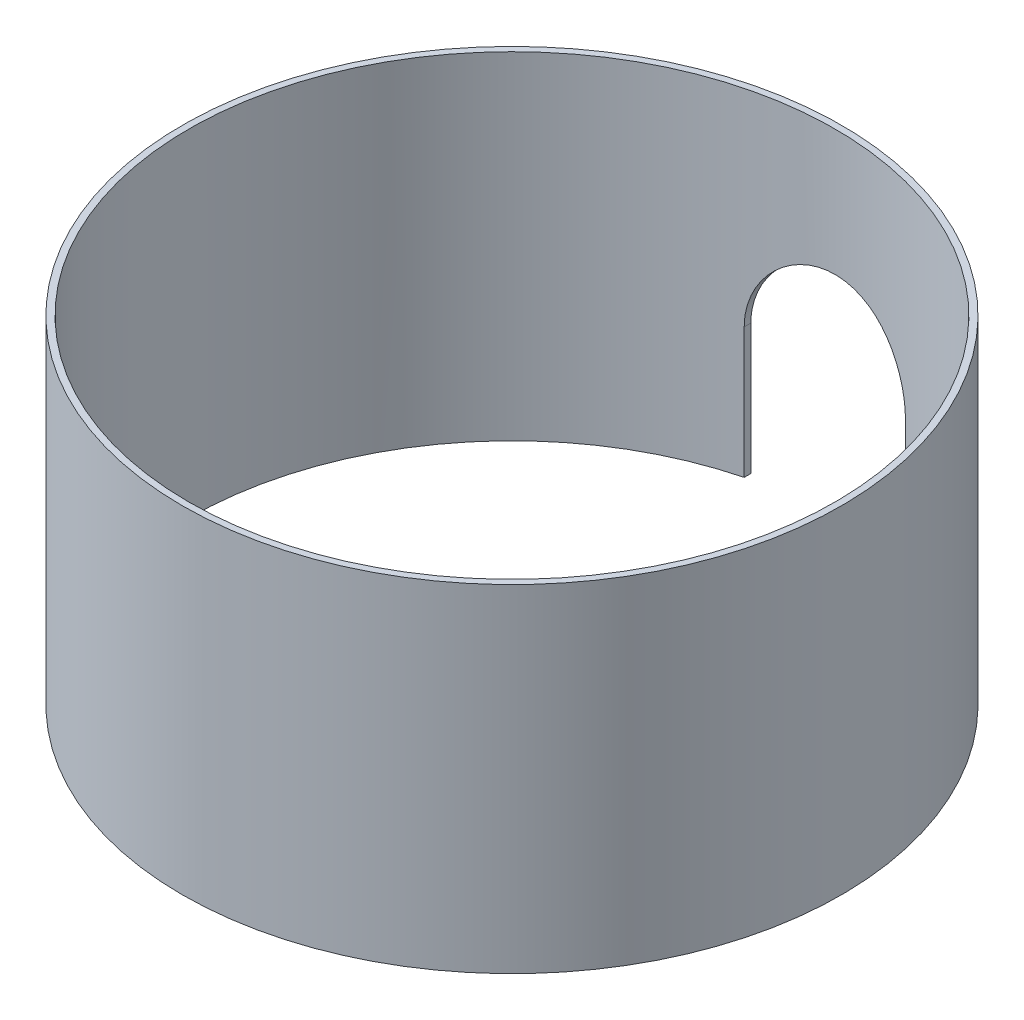
ISO-10303-21;
HEADER;
FILE_DESCRIPTION(('STEP AP214'),'2;1');
FILE_NAME('part.step','',(''),(''),'','','');
FILE_SCHEMA(('AUTOMOTIVE_DESIGN { 1 0 10303 214 1 1 1 1 }'));
ENDSEC;
DATA;
#1=APPLICATION_CONTEXT('core data for automotive mechanical design processes');
#2=APPLICATION_PROTOCOL_DEFINITION('international standard','automotive_design',2000,#1);
#3=PRODUCT_CONTEXT('',#1,'mechanical');
#4=PRODUCT('Part','Part','',(#3));
#5=PRODUCT_RELATED_PRODUCT_CATEGORY('part','',(#4));
#6=PRODUCT_DEFINITION_FORMATION('','',#4);
#7=PRODUCT_DEFINITION_CONTEXT('part definition',#1,'design');
#8=PRODUCT_DEFINITION('design','',#6,#7);
#9=PRODUCT_DEFINITION_SHAPE('','',#8);
#10=(LENGTH_UNIT() NAMED_UNIT(*) SI_UNIT(.MILLI.,.METRE.));
#11=(NAMED_UNIT(*) PLANE_ANGLE_UNIT() SI_UNIT($,.RADIAN.));
#12=(NAMED_UNIT(*) SI_UNIT($,.STERADIAN.) SOLID_ANGLE_UNIT());
#13=UNCERTAINTY_MEASURE_WITH_UNIT(LENGTH_MEASURE(1.E-05),#10,'distance_accuracy_value','');
#14=(GEOMETRIC_REPRESENTATION_CONTEXT(3) GLOBAL_UNCERTAINTY_ASSIGNED_CONTEXT((#13)) GLOBAL_UNIT_ASSIGNED_CONTEXT((#10,
#11,#12)) REPRESENTATION_CONTEXT('',''));
#15=CARTESIAN_POINT('',(0.,0.,0.));
#16=DIRECTION('',(0.,0.,1.));
#17=DIRECTION('',(1.,0.,0.));
#18=AXIS2_PLACEMENT_3D('',#15,#16,#17);
#19=CARTESIAN_POINT('',(-43.8588027188166,54.,17.1756459154877));
#20=DIRECTION('',(0.,-1.,0.));
#21=DIRECTION('',(0.,0.,-1.));
#22=AXIS2_PLACEMENT_3D('',#19,#20,#21);
#23=CYLINDRICAL_SURFACE('',#22,51.837999999999);
#24=CARTESIAN_POINT('',(-43.8588027188166,0.,17.1756459154877));
#25=DIRECTION('',(0.,1.,0.));
#26=DIRECTION('',(0.,0.,1.));
#27=AXIS2_PLACEMENT_3D('',#24,#25,#26);
#28=CIRCLE('',#27,51.837999999999);
#29=CARTESIAN_POINT('',(-56.5408027188166,0.,-33.0871148523004));
#30=VERTEX_POINT('',#29);
#31=CARTESIAN_POINT('',(-31.1768027188166,0.,-33.0871148523004));
#32=VERTEX_POINT('',#31);
#33=EDGE_CURVE('E94',#30,#32,#28,.T.);
#34=ORIENTED_EDGE('',*,*,#33,.T.);
#35=DIRECTION('',(0.,-1.,0.));
#36=VECTOR('',#35,1.);
#37=CARTESIAN_POINT('',(-31.1768027188166,54.,-33.0871148523004));
#38=LINE('',#37,#36);
#39=CARTESIAN_POINT('',(-31.1768027188166,20.5,-33.0871148523004));
#40=VERTEX_POINT('',#39);
#41=EDGE_CURVE('E55',#32,#40,#38,.F.);
#42=ORIENTED_EDGE('',*,*,#41,.T.);
#43=CARTESIAN_POINT('',(-31.1768027188166,20.5,-33.0871148523004));
#44=CARTESIAN_POINT('',(-31.1767585044862,20.8509707048646,-33.0870753782632));
#45=CARTESIAN_POINT('',(-31.1913702711197,21.2019276565611,-33.0907896110445));
#46=CARTESIAN_POINT('',(-31.2495807896242,21.9012222699142,-33.1054382651482));
#47=CARTESIAN_POINT('',(-31.2931748180934,22.2495603490293,-33.1163715099456));
#48=CARTESIAN_POINT('',(-31.4089137429404,22.9404768257428,-33.1451434593775));
#49=CARTESIAN_POINT('',(-31.4810036017332,23.2830650069326,-33.1629688508999));
#50=CARTESIAN_POINT('',(-31.653125949201,23.9607486776484,-33.2049812205444));
#51=CARTESIAN_POINT('',(-31.7531587897458,24.2958440727647,-33.2291682787751));
#52=CARTESIAN_POINT('',(-31.9803581518208,24.956185678297,-33.2831927837449));
#53=CARTESIAN_POINT('',(-32.1075214102456,25.2814330678124,-33.3130295509179));
#54=CARTESIAN_POINT('',(-32.3880209481271,25.919953227353,-33.3774955176801));
#55=CARTESIAN_POINT('',(-32.5413581804994,26.233225560894,-33.412124891745));
#56=CARTESIAN_POINT('',(-32.8731185152568,26.8458035527891,-33.4852051163808));
#57=CARTESIAN_POINT('',(-33.0515466880763,27.1451063718286,-33.5236567388987));
#58=CARTESIAN_POINT('',(-33.432223198295,27.7277708993825,-33.6033111894605));
#59=CARTESIAN_POINT('',(-33.6344718100622,28.0111324242268,-33.6445140491912));
#60=CARTESIAN_POINT('',(-34.0654214421825,28.5652515208272,-33.729334526315));
#61=CARTESIAN_POINT('',(-34.2945453608089,28.8356755827307,-33.7729828433602));
#62=CARTESIAN_POINT('',(-34.7746725702008,29.3564778434316,-33.8607762860972));
#63=CARTESIAN_POINT('',(-35.0256853016841,29.6068473024012,-33.9049216189334));
#64=CARTESIAN_POINT('',(-35.5479006976855,30.0858008114417,-33.9924812779061));
#65=CARTESIAN_POINT('',(-35.8191068206723,30.3143811143849,-34.0358954772549));
#66=CARTESIAN_POINT('',(-36.3797736854292,30.7480632163629,-34.1207741022373));
#67=CARTESIAN_POINT('',(-36.6692262003645,30.9531754807606,-34.1622393920708));
#68=CARTESIAN_POINT('',(-37.2686469365962,31.3412251155452,-34.2426460598185));
#69=CARTESIAN_POINT('',(-37.5788403896085,31.523823506795,-34.2815455137599));
#70=CARTESIAN_POINT('',(-38.2140279062847,31.8621797117428,-34.3550921426573));
#71=CARTESIAN_POINT('',(-38.5390221432348,32.0179372110883,-34.38973926781));
#72=CARTESIAN_POINT('',(-39.2014788646144,32.301365591604,-34.4537864231829));
#73=CARTESIAN_POINT('',(-39.5389393568719,32.4290409379638,-34.4831872874419));
#74=CARTESIAN_POINT('',(-40.2239421029105,32.6552872120294,-34.535900306431));
#75=CARTESIAN_POINT('',(-40.5714841319982,32.7538587878417,-34.5592125967451));
#76=CARTESIAN_POINT('',(-41.2672526248025,32.9194354410698,-34.5986832113195));
#77=CARTESIAN_POINT('',(-41.6153347041737,32.9870164077352,-34.6149716833242));
#78=CARTESIAN_POINT('',(-42.3161872841409,33.0928174855531,-34.6405825341867));
#79=CARTESIAN_POINT('',(-42.6689577300108,33.1310379391175,-34.6499049942844));
#80=CARTESIAN_POINT('',(-43.3765415447689,33.1777857589812,-34.6613182753683));
#81=CARTESIAN_POINT('',(-43.7313547031328,33.1863161321834,-34.6634098286741));
#82=CARTESIAN_POINT('',(-44.440413725083,33.1736174635119,-34.6603035825866));
#83=CARTESIAN_POINT('',(-44.7946595953477,33.1523887745874,-34.6551058696455));
#84=CARTESIAN_POINT('',(-45.4924328929101,33.0811264179135,-34.6377568279952));
#85=CARTESIAN_POINT('',(-45.8360279190726,33.0317158334055,-34.6257559467381));
#86=CARTESIAN_POINT('',(-46.5177281339013,32.9049760777509,-34.5952413901497));
#87=CARTESIAN_POINT('',(-46.8558334136606,32.8276473703539,-34.5767278230012));
#88=CARTESIAN_POINT('',(-47.5242274012856,32.6456888212515,-34.5336866164767));
#89=CARTESIAN_POINT('',(-47.8545159240128,32.5410583336122,-34.509158834811));
#90=CARTESIAN_POINT('',(-48.5050429606792,32.3053069369903,-34.4547448120285));
#91=CARTESIAN_POINT('',(-48.825281337324,32.1741856663005,-34.4248584977466));
#92=CARTESIAN_POINT('',(-49.456348182065,31.8851703598469,-34.360236940739));
#93=CARTESIAN_POINT('',(-49.7670699239587,31.7270523113126,-34.3254615951647));
#94=CARTESIAN_POINT('',(-50.3741168879895,31.3860008889086,-34.2521910056178));
#95=CARTESIAN_POINT('',(-50.6704420596137,31.203067427978,-34.2136957485946));
#96=CARTESIAN_POINT('',(-51.2467772033046,30.8136750221383,-34.134009218759));
#97=CARTESIAN_POINT('',(-51.5267888467712,30.60721849371,-34.0928182230594));
#98=CARTESIAN_POINT('',(-52.0688893748692,30.1720459186625,-34.0088048908183));
#99=CARTESIAN_POINT('',(-52.3309700673871,29.9433198118531,-33.9659818223603));
#100=CARTESIAN_POINT('',(-52.8419513920093,29.4589767583396,-33.8787388076756));
#101=CARTESIAN_POINT('',(-53.090336065702,29.2028174525517,-33.8343062003977));
#102=CARTESIAN_POINT('',(-53.5646056134369,28.670528158071,-33.7461942224303));
#103=CARTESIAN_POINT('',(-53.7904997021447,28.3944064289319,-33.7025145493703));
#104=CARTESIAN_POINT('',(-54.2184708309127,27.8237734423511,-33.6171013497601));
#105=CARTESIAN_POINT('',(-54.4205356908181,27.5292528971171,-33.5753688250117));
#106=CARTESIAN_POINT('',(-54.7992745823893,26.9239133922463,-33.4950735197316));
#107=CARTESIAN_POINT('',(-54.9759494202964,26.6130949505652,-33.4565106385669));
#108=CARTESIAN_POINT('',(-55.3034374926201,25.975628703155,-33.3834965317564));
#109=CARTESIAN_POINT('',(-55.4541147329495,25.6489084788812,-33.3490671979016));
#110=CARTESIAN_POINT('',(-55.7273149746639,24.9834041524799,-33.2855901257495));
#111=CARTESIAN_POINT('',(-55.8498391366058,24.6446205483073,-33.256542165625));
#112=CARTESIAN_POINT('',(-56.0655992816015,23.9578379505915,-33.2047537839777));
#113=CARTESIAN_POINT('',(-56.1588707713346,23.6098506893356,-33.1820057196434));
#114=CARTESIAN_POINT('',(-56.3154944669017,22.9069726920279,-33.1434913344369));
#115=CARTESIAN_POINT('',(-56.3788607128849,22.552085277162,-33.127721737476));
#116=CARTESIAN_POINT('',(-56.4649050236852,21.9141020575863,-33.1062196009803));
#117=CARTESIAN_POINT('',(-56.49337571215,21.6318207726182,-33.099064399881));
#118=CARTESIAN_POINT('',(-56.5313167181213,21.0663676287976,-33.0895081262319));
#119=CARTESIAN_POINT('',(-56.5408179556212,20.7831979739716,-33.0870993171999));
#120=CARTESIAN_POINT('',(-56.5408027188166,20.5,-33.0871148523004));
#121=B_SPLINE_CURVE_WITH_KNOTS('',3,(#43,#44,#45,#46,#47,#48,#49,#50,#51,#52,#53,#54,#55,#56,
#57,#58,#59,#60,#61,#62,#63,#64,#65,#66,#67,#68,#69,#70,#71,#72,#73,#74,#75,#76,#77,#78,#79,#80,
#81,#82,#83,#84,#85,#86,#87,#88,#89,#90,#91,#92,#93,#94,#95,#96,#97,#98,#99,#100,#101,#102,#103,
#104,#105,#106,#107,#108,#109,#110,#111,#112,#113,#114,#115,#116,#117,#118,#119,#120),
.UNSPECIFIED.,.F.,.F.,(4,2,2,2,2,2,2,2,2,2,2,2,2,2,2,2,2,2,2,2,2,2,2,2,2,2,2,2,2,2,2,2,2,2,2,2,
2,2,4),(0.,1.05256749515762,2.10496348952467,3.15533671367383,4.20572316515953,5.25598335277734,
6.30628178535992,7.35679277047235,8.40731585673617,9.47742605807436,10.5480001061494,
11.6187579322334,12.6890363868366,13.7738499176191,14.8586761525543,15.9433297703077,
17.0279592322905,18.0915235173034,19.1550753984936,20.2185195639028,21.2819511167325,
22.3227349440202,23.3635014835789,24.4042926489108,25.4450980262484,26.4950015239431,
27.544908705144,28.5947081284186,29.6449840142828,30.7224144680639,31.7994016530838,
32.8769369686977,33.9544380604155,35.0374151095323,36.1203475069749,37.2019603158011,
38.2830648141226,39.1338226433498,39.9831926109577),.UNSPECIFIED.);
#122=CARTESIAN_POINT('',(-56.5408027188166,20.5,-33.0871148523004));
#123=VERTEX_POINT('',#122);
#124=EDGE_CURVE('E84',#40,#123,#121,.T.);
#125=ORIENTED_EDGE('',*,*,#124,.T.);
#126=DIRECTION('',(0.,-1.,0.));
#127=VECTOR('',#126,1.);
#128=CARTESIAN_POINT('',(-56.5408027188166,54.,-33.0871148523004));
#129=LINE('',#128,#127);
#130=EDGE_CURVE('E71',#123,#30,#129,.T.);
#131=ORIENTED_EDGE('',*,*,#130,.T.);
#132=EDGE_LOOP('',(#34,#42,#125,#131));
#133=FACE_BOUND('',#132,.T.);
#134=CARTESIAN_POINT('',(-43.8588027188167,53.,17.1756459154878));
#135=DIRECTION('',(0.,1.,0.));
#136=DIRECTION('',(0.,0.,1.));
#137=AXIS2_PLACEMENT_3D('',#134,#135,#136);
#138=CIRCLE('',#137,51.8379999999991);
#139=CARTESIAN_POINT('',(-43.8588027188167,53.,69.0136459154869));
#140=VERTEX_POINT('',#139);
#141=EDGE_CURVE('E88',#140,#140,#138,.T.);
#142=ORIENTED_EDGE('',*,*,#141,.F.);
#143=EDGE_LOOP('',(#142));
#144=FACE_BOUND('',#143,.T.);
#145=ADVANCED_FACE('F32',(#133,#144),#23,.T.);
#146=CARTESIAN_POINT('',(-43.8588027188166,54.,17.1756459154877));
#147=DIRECTION('',(0.,-1.,0.));
#148=DIRECTION('',(0.,0.,-1.));
#149=AXIS2_PLACEMENT_3D('',#146,#147,#148);
#150=CYLINDRICAL_SURFACE('',#149,50.821999999999);
#151=DIRECTION('',(0.,-1.,0.));
#152=VECTOR('',#151,1.);
#153=CARTESIAN_POINT('',(-31.1768027188166,54.,-32.0386056789427));
#154=LINE('',#153,#152);
#155=CARTESIAN_POINT('',(-31.1768027188166,0.,-32.0386056789427));
#156=VERTEX_POINT('',#155);
#157=CARTESIAN_POINT('',(-31.1768027188166,20.5,-32.0386056789427));
#158=VERTEX_POINT('',#157);
#159=EDGE_CURVE('E11',#156,#158,#154,.F.);
#160=ORIENTED_EDGE('',*,*,#159,.F.);
#161=CARTESIAN_POINT('',(-43.8588027188166,0.,17.1756459154877));
#162=DIRECTION('',(0.,1.,0.));
#163=DIRECTION('',(0.,0.,1.));
#164=AXIS2_PLACEMENT_3D('',#161,#162,#163);
#165=CIRCLE('',#164,50.821999999999);
#166=CARTESIAN_POINT('',(-56.5408027188166,0.,-32.0386056789427));
#167=VERTEX_POINT('',#166);
#168=EDGE_CURVE('E91',#167,#156,#165,.T.);
#169=ORIENTED_EDGE('',*,*,#168,.F.);
#170=DIRECTION('',(0.,-1.,0.));
#171=VECTOR('',#170,1.);
#172=CARTESIAN_POINT('',(-56.5408027188166,54.,-32.0386056789427));
#173=LINE('',#172,#171);
#174=CARTESIAN_POINT('',(-56.5408027188166,20.5,-32.0386056789427));
#175=VERTEX_POINT('',#174);
#176=EDGE_CURVE('E119',#175,#167,#173,.T.);
#177=ORIENTED_EDGE('',*,*,#176,.F.);
#178=CARTESIAN_POINT('',(-31.1768027188166,20.5,-32.0386056789427));
#179=CARTESIAN_POINT('',(-31.1767582689461,20.8507377820753,-32.0385653142195));
#180=CARTESIAN_POINT('',(-31.1913509249865,21.2014614631637,-32.0423537456024));
#181=CARTESIAN_POINT('',(-31.2494835363236,21.9002866464232,-32.0572944126135));
#182=CARTESIAN_POINT('',(-31.2930186341031,22.248388578699,-32.0684454125525));
#183=CARTESIAN_POINT('',(-31.4085954112721,22.9388146411116,-32.0977886669509));
#184=CARTESIAN_POINT('',(-31.4805807381247,23.2811488065053,-32.1159670005345));
#185=CARTESIAN_POINT('',(-31.652447167193,23.958325815385,-32.158809140548));
#186=CARTESIAN_POINT('',(-31.7523286502044,24.2931685565423,-32.1834730355087));
#187=CARTESIAN_POINT('',(-31.9791733058145,24.9530024196826,-32.238559344952));
#188=CARTESIAN_POINT('',(-32.1061325651499,25.277994957468,-32.2689809272658));
#189=CARTESIAN_POINT('',(-32.3861724574447,25.9160188070689,-32.3347076957772));
#190=CARTESIAN_POINT('',(-32.5392540642493,26.2290496724187,-32.3700130640337));
#191=CARTESIAN_POINT('',(-32.8704547460857,26.8411717038708,-32.4445182703311));
#192=CARTESIAN_POINT('',(-33.0485792795551,27.1402598119893,-32.4837189568605));
#193=CARTESIAN_POINT('',(-33.4286014285265,27.7225268237626,-32.5649242891511));
#194=CARTESIAN_POINT('',(-33.6304993322842,28.0057055344522,-32.6069289689084));
#195=CARTESIAN_POINT('',(-34.0608631863133,28.5597092023141,-32.6934342176518));
#196=CARTESIAN_POINT('',(-34.2897688352915,28.8301875893851,-32.7379674102476));
#197=CARTESIAN_POINT('',(-34.7694565639705,29.3511205787868,-32.8275441020738));
#198=CARTESIAN_POINT('',(-35.0202480852092,29.6015664489295,-32.8725878141777));
#199=CARTESIAN_POINT('',(-35.5420252675904,30.0806999303661,-32.9619343062629));
#200=CARTESIAN_POINT('',(-35.8130144025154,30.3093837833457,-33.0062369571775));
#201=CARTESIAN_POINT('',(-36.3732593177491,30.7433025980328,-33.092859320183));
#202=CARTESIAN_POINT('',(-36.662506867279,30.9485480100711,-33.1351799109969));
#203=CARTESIAN_POINT('',(-37.2617065558371,31.3370071330971,-33.2172773948054));
#204=CARTESIAN_POINT('',(-37.5718938360076,31.5198678115467,-33.257009795512));
#205=CARTESIAN_POINT('',(-38.2071126512894,31.8587458877646,-33.3321391844322));
#206=CARTESIAN_POINT('',(-38.5321443675689,32.0147629578106,-33.3675361197143));
#207=CARTESIAN_POINT('',(-39.1947197118941,32.2987006012798,-33.4329778824801));
#208=CARTESIAN_POINT('',(-39.5322612907197,32.4266257528266,-33.4630235819005));
#209=CARTESIAN_POINT('',(-40.2174693613392,32.6533548825849,-33.516902419549));
#210=CARTESIAN_POINT('',(-40.5651356179548,32.7521595366219,-33.5407357019528));
#211=CARTESIAN_POINT('',(-41.2609244020342,32.9181108628732,-33.5810845656068));
#212=CARTESIAN_POINT('',(-41.6088962614287,32.9858559266267,-33.5977380595331));
#213=CARTESIAN_POINT('',(-42.3095527606696,33.092000970055,-33.6239445984286));
#214=CARTESIAN_POINT('',(-42.6622373433488,33.1304013053648,-33.6334977294487));
#215=CARTESIAN_POINT('',(-43.3696686299196,33.1775206424615,-33.6452313651078));
#216=CARTESIAN_POINT('',(-43.7244151110536,33.1862427929546,-33.6474126518624));
#217=CARTESIAN_POINT('',(-44.4333570350436,33.1739375941968,-33.6443424474293));
#218=CARTESIAN_POINT('',(-44.7875524846597,33.1529106128374,-33.6390910481576));
#219=CARTESIAN_POINT('',(-45.4849365065039,33.0820874515332,-33.6215030704172));
#220=CARTESIAN_POINT('',(-45.8281951056573,33.0329388202685,-33.609326003797));
#221=CARTESIAN_POINT('',(-46.5092417221978,32.906781585662,-33.5783396836379));
#222=CARTESIAN_POINT('',(-46.8470298340244,32.8297734638084,-33.5595305447194));
#223=CARTESIAN_POINT('',(-47.5148131624874,32.648514941702,-33.5157857866078));
#224=CARTESIAN_POINT('',(-47.8448081916007,32.5442638866356,-33.4908500201553));
#225=CARTESIAN_POINT('',(-48.4947777849899,32.3093301315826,-33.4355170257711));
#226=CARTESIAN_POINT('',(-48.8147522077776,32.1786470585774,-33.4051197207648));
#227=CARTESIAN_POINT('',(-49.4454097305922,31.8905316895365,-33.3393709848731));
#228=CARTESIAN_POINT('',(-49.7559831694812,31.7328690392339,-33.3039773935259));
#229=CARTESIAN_POINT('',(-50.3627722890589,31.3927716104512,-33.2293887476558));
#230=CARTESIAN_POINT('',(-50.6589879184398,31.2103367434562,-33.1901936795498));
#231=CARTESIAN_POINT('',(-51.2351533796048,30.8219795103497,-33.109041398993));
#232=CARTESIAN_POINT('',(-51.5151047780998,30.6160594122194,-33.0670844534234));
#233=CARTESIAN_POINT('',(-52.0571413852251,30.1819926002421,-32.9814897687524));
#234=CARTESIAN_POINT('',(-52.3192184241841,29.9538358370809,-32.9378512751536));
#235=CARTESIAN_POINT('',(-52.830518229097,29.4704249106309,-32.8488795688243));
#236=CARTESIAN_POINT('',(-53.0792060336971,29.2146071769519,-32.8035323342618));
#237=CARTESIAN_POINT('',(-53.5541124165479,28.6829754088409,-32.7135819360963));
#238=CARTESIAN_POINT('',(-53.7803401770662,28.4071696265035,-32.6689784746759));
#239=CARTESIAN_POINT('',(-54.2090108026225,27.8371351693463,-32.5817330315754));
#240=CARTESIAN_POINT('',(-54.4114414968194,27.5428971844107,-32.5390920603222));
#241=CARTESIAN_POINT('',(-54.7909429072572,26.9380808499652,-32.4570217555745));
#242=CARTESIAN_POINT('',(-54.9680144259747,26.6275030179458,-32.4175923204698));
#243=CARTESIAN_POINT('',(-55.2963809344841,25.9903609805994,-32.3428961837124));
#244=CARTESIAN_POINT('',(-55.447530931251,25.6637192151935,-32.3076532160453));
#245=CARTESIAN_POINT('',(-55.7216781274134,24.9983087087392,-32.2426475773425));
#246=CARTESIAN_POINT('',(-55.8446765114537,24.6595404786772,-32.2128846757108));
#247=CARTESIAN_POINT('',(-56.0613770216665,23.9727249069559,-32.1597907692661));
#248=CARTESIAN_POINT('',(-56.1551146689867,23.6246893770654,-32.13645197));
#249=CARTESIAN_POINT('',(-56.3126535259277,22.9216553231087,-32.0969009441389));
#250=CARTESIAN_POINT('',(-56.3764687625087,22.5666601430456,-32.080685378556));
#251=CARTESIAN_POINT('',(-56.4635982781125,21.926185805134,-32.0584524806071));
#252=CARTESIAN_POINT('',(-56.4925585516296,21.6415099909908,-32.0510197476685));
#253=CARTESIAN_POINT('',(-56.5311531658163,21.0712307478863,-32.0410920702778));
#254=CARTESIAN_POINT('',(-56.5408187905217,20.785629573771,-32.0385891328219));
#255=CARTESIAN_POINT('',(-56.5408027188166,20.5,-32.0386056789427));
#256=B_SPLINE_CURVE_WITH_KNOTS('',3,(#178,#179,#180,#181,#182,#183,#184,#185,#186,#187,#188,
#189,#190,#191,#192,#193,#194,#195,#196,#197,#198,#199,#200,#201,#202,#203,#204,#205,#206,#207,
#208,#209,#210,#211,#212,#213,#214,#215,#216,#217,#218,#219,#220,#221,#222,#223,#224,#225,#226,
#227,#228,#229,#230,#231,#232,#233,#234,#235,#236,#237,#238,#239,#240,#241,#242,#243,#244,#245,
#246,#247,#248,#249,#250,#251,#252,#253,#254,#255),.UNSPECIFIED.,.F.,.F.,(4,2,2,2,2,2,2,2,2,2,2,
2,2,2,2,2,2,2,2,2,2,2,2,2,2,2,2,2,2,2,2,2,2,2,2,2,2,2,4),(0.,1.05186795800862,2.10355942167417,
3.15317811377171,4.20281113436076,5.25229256530401,6.301813129631,7.3515628065443,
8.4013252131372,9.47146785602974,10.5420744611319,11.6128656263967,12.6831774860504,
13.7686415326479,14.8541188302836,15.9394190968183,17.0246941738298,18.0880774235653,
19.1514477857236,20.2147053261095,21.2779497178726,22.3176434389094,23.3573191920543,
24.3970199372391,25.4367353560964,26.4858165920286,27.5349015765874,28.5838853361052,
29.6333453758537,30.7110179714199,31.7882481554354,32.866026906095,33.9437715435245,
35.0273607677432,36.1109043851756,37.1931274700975,38.2748427244685,39.1328949766168,
39.9895548628552),.UNSPECIFIED.);
#257=EDGE_CURVE('E40',#158,#175,#256,.T.);
#258=ORIENTED_EDGE('',*,*,#257,.F.);
#259=EDGE_LOOP('',(#160,#169,#177,#258));
#260=FACE_BOUND('',#259,.T.);
#261=CARTESIAN_POINT('',(-43.8588027188166,53.,17.1756459154877));
#262=DIRECTION('',(0.,1.,0.));
#263=DIRECTION('',(0.,0.,1.));
#264=AXIS2_PLACEMENT_3D('',#261,#262,#263);
#265=CIRCLE('',#264,50.821999999999);
#266=CARTESIAN_POINT('',(-43.8588027188166,53.,67.9976459154867));
#267=VERTEX_POINT('',#266);
#268=EDGE_CURVE('E128',#267,#267,#265,.T.);
#269=ORIENTED_EDGE('',*,*,#268,.T.);
#270=EDGE_LOOP('',(#269));
#271=FACE_BOUND('',#270,.T.);
#272=ADVANCED_FACE('F111',(#260,#271),#150,.F.);
#273=CARTESIAN_POINT('',(-43.8588027188166,0.,17.1756459154877));
#274=DIRECTION('',(0.,1.,0.));
#275=DIRECTION('',(0.,0.,1.));
#276=AXIS2_PLACEMENT_3D('',#273,#274,#275);
#277=PLANE('',#276);
#278=ORIENTED_EDGE('',*,*,#168,.T.);
#279=DIRECTION('',(0.,0.,-1.));
#280=VECTOR('',#279,1.);
#281=CARTESIAN_POINT('',(-31.1768027188166,0.,17.1756459154877));
#282=LINE('',#281,#280);
#283=EDGE_CURVE('E79',#156,#32,#282,.T.);
#284=ORIENTED_EDGE('',*,*,#283,.T.);
#285=ORIENTED_EDGE('',*,*,#33,.F.);
#286=DIRECTION('',(0.,0.,1.));
#287=VECTOR('',#286,1.);
#288=CARTESIAN_POINT('',(-56.5408027188166,0.,17.1756459154877));
#289=LINE('',#288,#287);
#290=EDGE_CURVE('E74',#30,#167,#289,.T.);
#291=ORIENTED_EDGE('',*,*,#290,.T.);
#292=EDGE_LOOP('',(#278,#284,#285,#291));
#293=FACE_BOUND('',#292,.T.);
#294=ADVANCED_FACE('F109',(#293),#277,.F.);
#295=CARTESIAN_POINT('',(-43.8588027188166,20.5,-53.));
#296=DIRECTION('',(0.,0.,1.));
#297=DIRECTION('',(1.,0.,0.));
#298=AXIS2_PLACEMENT_3D('',#295,#296,#297);
#299=CYLINDRICAL_SURFACE('',#298,12.682);
#300=DIRECTION('',(0.,0.,1.));
#301=VECTOR('',#300,1.);
#302=CARTESIAN_POINT('',(-31.1768027188166,20.5,-53.));
#303=LINE('',#302,#301);
#304=EDGE_CURVE('E87',#40,#158,#303,.T.);
#305=ORIENTED_EDGE('',*,*,#304,.T.);
#306=ORIENTED_EDGE('',*,*,#257,.T.);
#307=DIRECTION('',(0.,0.,1.));
#308=VECTOR('',#307,1.);
#309=CARTESIAN_POINT('',(-56.5408027188166,20.5,-53.));
#310=LINE('',#309,#308);
#311=EDGE_CURVE('E47',#123,#175,#310,.T.);
#312=ORIENTED_EDGE('',*,*,#311,.F.);
#313=ORIENTED_EDGE('',*,*,#124,.F.);
#314=EDGE_LOOP('',(#305,#306,#312,#313));
#315=FACE_BOUND('',#314,.T.);
#316=ADVANCED_FACE('F83',(#315),#299,.F.);
#317=CARTESIAN_POINT('',(-31.1768027188166,-11.133422885371,-53.));
#318=DIRECTION('',(1.,0.,0.));
#319=DIRECTION('',(0.,1.,0.));
#320=AXIS2_PLACEMENT_3D('',#317,#318,#319);
#321=PLANE('',#320);
#322=ORIENTED_EDGE('',*,*,#283,.F.);
#323=ORIENTED_EDGE('',*,*,#159,.T.);
#324=ORIENTED_EDGE('',*,*,#304,.F.);
#325=ORIENTED_EDGE('',*,*,#41,.F.);
#326=EDGE_LOOP('',(#322,#323,#324,#325));
#327=FACE_BOUND('',#326,.T.);
#328=ADVANCED_FACE('F108',(#327),#321,.F.);
#329=CARTESIAN_POINT('',(-56.5408027188166,20.5,-53.));
#330=DIRECTION('',(-1.,0.,0.));
#331=DIRECTION('',(0.,-1.,0.));
#332=AXIS2_PLACEMENT_3D('',#329,#330,#331);
#333=PLANE('',#332);
#334=ORIENTED_EDGE('',*,*,#311,.T.);
#335=ORIENTED_EDGE('',*,*,#176,.T.);
#336=ORIENTED_EDGE('',*,*,#290,.F.);
#337=ORIENTED_EDGE('',*,*,#130,.F.);
#338=EDGE_LOOP('',(#334,#335,#336,#337));
#339=FACE_BOUND('',#338,.T.);
#340=ADVANCED_FACE('F72',(#339),#333,.F.);
#341=CARTESIAN_POINT('',(-43.8588027188167,53.,17.1756459154878));
#342=DIRECTION('',(0.,1.,0.));
#343=DIRECTION('',(0.,0.,1.));
#344=AXIS2_PLACEMENT_3D('',#341,#342,#343);
#345=PLANE('',#344);
#346=ORIENTED_EDGE('',*,*,#268,.F.);
#347=EDGE_LOOP('',(#346));
#348=FACE_BOUND('',#347,.T.);
#349=ORIENTED_EDGE('',*,*,#141,.T.);
#350=EDGE_LOOP('',(#349));
#351=FACE_BOUND('',#350,.T.);
#352=ADVANCED_FACE('F133',(#348,#351),#345,.T.);
#353=CLOSED_SHELL('',(#145,#272,#294,#316,#328,#340,#352));
#354=MANIFOLD_SOLID_BREP('B2',#353);
#355=ADVANCED_BREP_SHAPE_REPRESENTATION('',(#18,#354),#14);
#356=SHAPE_DEFINITION_REPRESENTATION(#9,#355);
ENDSEC;
END-ISO-10303-21;
